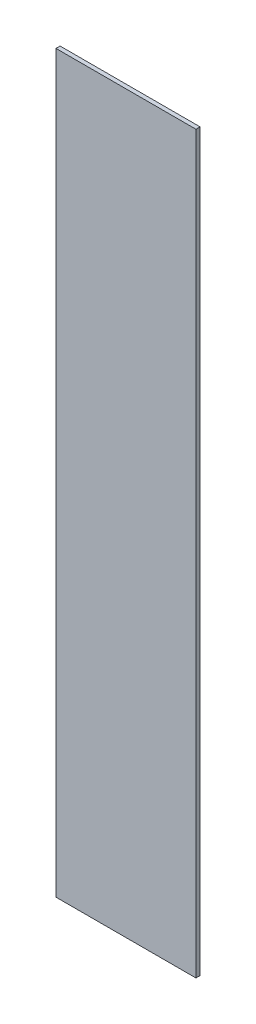
ISO-10303-21;
HEADER;
FILE_DESCRIPTION(('STEP AP214'),'2;1');
FILE_NAME('part.step','',(''),(''),'','','');
FILE_SCHEMA(('AUTOMOTIVE_DESIGN { 1 0 10303 214 1 1 1 1 }'));
ENDSEC;
DATA;
#1=APPLICATION_CONTEXT('core data for automotive mechanical design processes');
#2=APPLICATION_PROTOCOL_DEFINITION('international standard','automotive_design',2000,#1);
#3=PRODUCT_CONTEXT('',#1,'mechanical');
#4=PRODUCT('Part','Part','',(#3));
#5=PRODUCT_RELATED_PRODUCT_CATEGORY('part','',(#4));
#6=PRODUCT_DEFINITION_FORMATION('','',#4);
#7=PRODUCT_DEFINITION_CONTEXT('part definition',#1,'design');
#8=PRODUCT_DEFINITION('design','',#6,#7);
#9=PRODUCT_DEFINITION_SHAPE('','',#8);
#10=(LENGTH_UNIT() NAMED_UNIT(*) SI_UNIT(.MILLI.,.METRE.));
#11=(NAMED_UNIT(*) PLANE_ANGLE_UNIT() SI_UNIT($,.RADIAN.));
#12=(NAMED_UNIT(*) SI_UNIT($,.STERADIAN.) SOLID_ANGLE_UNIT());
#13=UNCERTAINTY_MEASURE_WITH_UNIT(LENGTH_MEASURE(1.E-05),#10,'distance_accuracy_value','');
#14=(GEOMETRIC_REPRESENTATION_CONTEXT(3) GLOBAL_UNCERTAINTY_ASSIGNED_CONTEXT((#13)) GLOBAL_UNIT_ASSIGNED_CONTEXT((#10,
#11,#12)) REPRESENTATION_CONTEXT('',''));
#15=CARTESIAN_POINT('',(0.,0.,0.));
#16=DIRECTION('',(0.,0.,1.));
#17=DIRECTION('',(1.,0.,0.));
#18=AXIS2_PLACEMENT_3D('',#15,#16,#17);
#19=CARTESIAN_POINT('',(-50.8,266.7,2.9972));
#20=DIRECTION('',(1.,0.,0.));
#21=DIRECTION('',(0.,1.,0.));
#22=AXIS2_PLACEMENT_3D('',#19,#20,#21);
#23=PLANE('',#22);
#24=DIRECTION('',(0.,-1.,0.));
#25=VECTOR('',#24,1.);
#26=CARTESIAN_POINT('',(-50.8,266.7,0.));
#27=LINE('',#26,#25);
#28=CARTESIAN_POINT('',(-50.8,266.7,0.));
#29=VERTEX_POINT('',#28);
#30=CARTESIAN_POINT('',(-50.8,-266.7,0.));
#31=VERTEX_POINT('',#30);
#32=EDGE_CURVE('E98',#29,#31,#27,.T.);
#33=ORIENTED_EDGE('',*,*,#32,.T.);
#34=DIRECTION('',(0.,0.,-1.));
#35=VECTOR('',#34,1.);
#36=CARTESIAN_POINT('',(-50.8,-266.7,2.9972));
#37=LINE('',#36,#35);
#38=CARTESIAN_POINT('',(-50.8,-266.7,2.9972));
#39=VERTEX_POINT('',#38);
#40=EDGE_CURVE('E11',#39,#31,#37,.T.);
#41=ORIENTED_EDGE('',*,*,#40,.F.);
#42=DIRECTION('',(0.,-1.,0.));
#43=VECTOR('',#42,1.);
#44=CARTESIAN_POINT('',(-50.8,266.7,2.9972));
#45=LINE('',#44,#43);
#46=CARTESIAN_POINT('',(-50.8,266.7,2.9972));
#47=VERTEX_POINT('',#46);
#48=EDGE_CURVE('E86',#47,#39,#45,.T.);
#49=ORIENTED_EDGE('',*,*,#48,.F.);
#50=DIRECTION('',(0.,0.,-1.));
#51=VECTOR('',#50,1.);
#52=CARTESIAN_POINT('',(-50.8,266.7,2.9972));
#53=LINE('',#52,#51);
#54=EDGE_CURVE('E94',#47,#29,#53,.T.);
#55=ORIENTED_EDGE('',*,*,#54,.T.);
#56=EDGE_LOOP('',(#33,#41,#49,#55));
#57=FACE_BOUND('',#56,.T.);
#58=ADVANCED_FACE('F35',(#57),#23,.F.);
#59=CARTESIAN_POINT('',(50.8,-266.7,2.9972));
#60=DIRECTION('',(0.,1.,0.));
#61=DIRECTION('',(0.,0.,1.));
#62=AXIS2_PLACEMENT_3D('',#59,#60,#61);
#63=PLANE('',#62);
#64=DIRECTION('',(1.,0.,0.));
#65=VECTOR('',#64,1.);
#66=CARTESIAN_POINT('',(50.8,-266.7,0.));
#67=LINE('',#66,#65);
#68=CARTESIAN_POINT('',(50.8,-266.7,0.));
#69=VERTEX_POINT('',#68);
#70=EDGE_CURVE('E90',#31,#69,#67,.T.);
#71=ORIENTED_EDGE('',*,*,#70,.T.);
#72=DIRECTION('',(0.,0.,-1.));
#73=VECTOR('',#72,1.);
#74=CARTESIAN_POINT('',(50.8,-266.7,2.9972));
#75=LINE('',#74,#73);
#76=CARTESIAN_POINT('',(50.8,-266.7,2.9972));
#77=VERTEX_POINT('',#76);
#78=EDGE_CURVE('E43',#77,#69,#75,.T.);
#79=ORIENTED_EDGE('',*,*,#78,.F.);
#80=DIRECTION('',(1.,0.,0.));
#81=VECTOR('',#80,1.);
#82=CARTESIAN_POINT('',(50.8,-266.7,2.9972));
#83=LINE('',#82,#81);
#84=EDGE_CURVE('E81',#39,#77,#83,.T.);
#85=ORIENTED_EDGE('',*,*,#84,.F.);
#86=ORIENTED_EDGE('',*,*,#40,.T.);
#87=EDGE_LOOP('',(#71,#79,#85,#86));
#88=FACE_BOUND('',#87,.T.);
#89=ADVANCED_FACE('F89',(#88),#63,.F.);
#90=CARTESIAN_POINT('',(50.8,266.7,2.9972));
#91=DIRECTION('',(-1.,0.,0.));
#92=DIRECTION('',(0.,-1.,0.));
#93=AXIS2_PLACEMENT_3D('',#90,#91,#92);
#94=PLANE('',#93);
#95=DIRECTION('',(0.,1.,0.));
#96=VECTOR('',#95,1.);
#97=CARTESIAN_POINT('',(50.8,266.7,0.));
#98=LINE('',#97,#96);
#99=CARTESIAN_POINT('',(50.8,266.7,0.));
#100=VERTEX_POINT('',#99);
#101=EDGE_CURVE('E68',#69,#100,#98,.T.);
#102=ORIENTED_EDGE('',*,*,#101,.T.);
#103=DIRECTION('',(0.,0.,-1.));
#104=VECTOR('',#103,1.);
#105=CARTESIAN_POINT('',(50.8,266.7,2.9972));
#106=LINE('',#105,#104);
#107=CARTESIAN_POINT('',(50.8,266.7,2.9972));
#108=VERTEX_POINT('',#107);
#109=EDGE_CURVE('E91',#108,#100,#106,.T.);
#110=ORIENTED_EDGE('',*,*,#109,.F.);
#111=DIRECTION('',(0.,1.,0.));
#112=VECTOR('',#111,1.);
#113=CARTESIAN_POINT('',(50.8,266.7,2.9972));
#114=LINE('',#113,#112);
#115=EDGE_CURVE('E84',#77,#108,#114,.T.);
#116=ORIENTED_EDGE('',*,*,#115,.F.);
#117=ORIENTED_EDGE('',*,*,#78,.T.);
#118=EDGE_LOOP('',(#102,#110,#116,#117));
#119=FACE_BOUND('',#118,.T.);
#120=ADVANCED_FACE('F92',(#119),#94,.F.);
#121=CARTESIAN_POINT('',(50.8,266.7,2.9972));
#122=DIRECTION('',(0.,-1.,0.));
#123=DIRECTION('',(0.,0.,-1.));
#124=AXIS2_PLACEMENT_3D('',#121,#122,#123);
#125=PLANE('',#124);
#126=DIRECTION('',(-1.,0.,0.));
#127=VECTOR('',#126,1.);
#128=CARTESIAN_POINT('',(50.8,266.7,0.));
#129=LINE('',#128,#127);
#130=EDGE_CURVE('E74',#100,#29,#129,.T.);
#131=ORIENTED_EDGE('',*,*,#130,.T.);
#132=ORIENTED_EDGE('',*,*,#54,.F.);
#133=DIRECTION('',(-1.,0.,0.));
#134=VECTOR('',#133,1.);
#135=CARTESIAN_POINT('',(50.8,266.7,2.9972));
#136=LINE('',#135,#134);
#137=EDGE_CURVE('E51',#108,#47,#136,.T.);
#138=ORIENTED_EDGE('',*,*,#137,.F.);
#139=ORIENTED_EDGE('',*,*,#109,.T.);
#140=EDGE_LOOP('',(#131,#132,#138,#139));
#141=FACE_BOUND('',#140,.T.);
#142=ADVANCED_FACE('F107',(#141),#125,.F.);
#143=CARTESIAN_POINT('',(0.,0.,2.9972));
#144=DIRECTION('',(0.,0.,-1.));
#145=DIRECTION('',(-1.,0.,0.));
#146=AXIS2_PLACEMENT_3D('',#143,#144,#145);
#147=PLANE('',#146);
#148=ORIENTED_EDGE('',*,*,#48,.T.);
#149=ORIENTED_EDGE('',*,*,#84,.T.);
#150=ORIENTED_EDGE('',*,*,#115,.T.);
#151=ORIENTED_EDGE('',*,*,#137,.T.);
#152=EDGE_LOOP('',(#148,#149,#150,#151));
#153=FACE_BOUND('',#152,.T.);
#154=ADVANCED_FACE('F82',(#153),#147,.F.);
#155=CARTESIAN_POINT('',(0.,0.,0.));
#156=DIRECTION('',(0.,0.,-1.));
#157=DIRECTION('',(-1.,0.,0.));
#158=AXIS2_PLACEMENT_3D('',#155,#156,#157);
#159=PLANE('',#158);
#160=ORIENTED_EDGE('',*,*,#32,.F.);
#161=ORIENTED_EDGE('',*,*,#130,.F.);
#162=ORIENTED_EDGE('',*,*,#101,.F.);
#163=ORIENTED_EDGE('',*,*,#70,.F.);
#164=EDGE_LOOP('',(#160,#161,#162,#163));
#165=FACE_BOUND('',#164,.T.);
#166=ADVANCED_FACE('F110',(#165),#159,.T.);
#167=CLOSED_SHELL('',(#58,#89,#120,#142,#154,#166));
#168=MANIFOLD_SOLID_BREP('B2',#167);
#169=ADVANCED_BREP_SHAPE_REPRESENTATION('',(#18,#168),#14);
#170=SHAPE_DEFINITION_REPRESENTATION(#9,#169);
ENDSEC;
END-ISO-10303-21;
